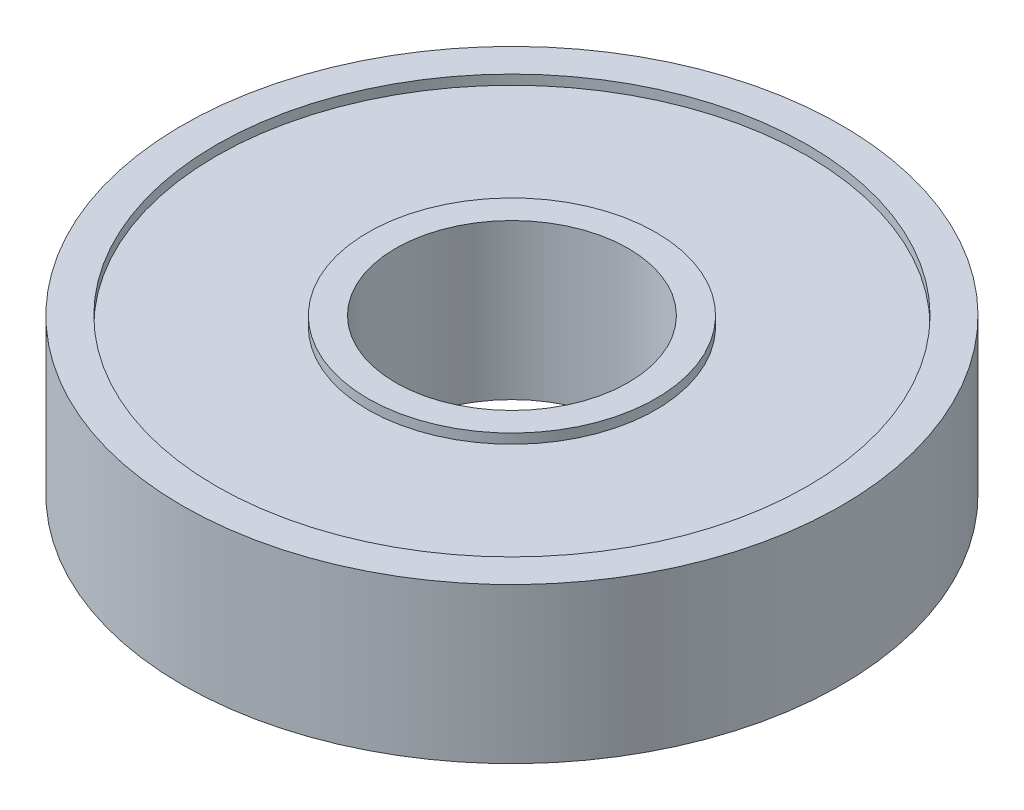
ISO-10303-21;
HEADER;
FILE_DESCRIPTION(('STEP AP214'),'2;1');
FILE_NAME('part.step','',(''),(''),'','','');
FILE_SCHEMA(('AUTOMOTIVE_DESIGN { 1 0 10303 214 1 1 1 1 }'));
ENDSEC;
DATA;
#1=APPLICATION_CONTEXT('core data for automotive mechanical design processes');
#2=APPLICATION_PROTOCOL_DEFINITION('international standard','automotive_design',2000,#1);
#3=PRODUCT_CONTEXT('',#1,'mechanical');
#4=PRODUCT('Part','Part','',(#3));
#5=PRODUCT_RELATED_PRODUCT_CATEGORY('part','',(#4));
#6=PRODUCT_DEFINITION_FORMATION('','',#4);
#7=PRODUCT_DEFINITION_CONTEXT('part definition',#1,'design');
#8=PRODUCT_DEFINITION('design','',#6,#7);
#9=PRODUCT_DEFINITION_SHAPE('','',#8);
#10=(LENGTH_UNIT() NAMED_UNIT(*) SI_UNIT(.MILLI.,.METRE.));
#11=(NAMED_UNIT(*) PLANE_ANGLE_UNIT() SI_UNIT($,.RADIAN.));
#12=(NAMED_UNIT(*) SI_UNIT($,.STERADIAN.) SOLID_ANGLE_UNIT());
#13=UNCERTAINTY_MEASURE_WITH_UNIT(LENGTH_MEASURE(1.E-05),#10,'distance_accuracy_value','');
#14=(GEOMETRIC_REPRESENTATION_CONTEXT(3) GLOBAL_UNCERTAINTY_ASSIGNED_CONTEXT((#13)) GLOBAL_UNIT_ASSIGNED_CONTEXT((#10,
#11,#12)) REPRESENTATION_CONTEXT('',''));
#15=CARTESIAN_POINT('',(0.,0.,0.));
#16=DIRECTION('',(0.,0.,1.));
#17=DIRECTION('',(1.,0.,0.));
#18=AXIS2_PLACEMENT_3D('',#15,#16,#17);
#19=CARTESIAN_POINT('',(0.,0.,0.));
#20=DIRECTION('',(0.,1.,0.));
#21=DIRECTION('',(0.,0.,1.));
#22=AXIS2_PLACEMENT_3D('',#19,#20,#21);
#23=PLANE('',#22);
#24=CARTESIAN_POINT('',(0.,0.,0.));
#25=DIRECTION('',(0.,1.,0.));
#26=DIRECTION('',(0.,0.,1.));
#27=AXIS2_PLACEMENT_3D('',#24,#25,#26);
#28=CIRCLE('',#27,6.);
#29=CARTESIAN_POINT('',(0.,0.,6.));
#30=VERTEX_POINT('',#29);
#31=EDGE_CURVE('E43',#30,#30,#28,.T.);
#32=ORIENTED_EDGE('',*,*,#31,.T.);
#33=EDGE_LOOP('',(#32));
#34=FACE_BOUND('',#33,.T.);
#35=CARTESIAN_POINT('',(0.,0.,0.));
#36=DIRECTION('',(0.,-1.,0.));
#37=DIRECTION('',(0.,0.,-1.));
#38=AXIS2_PLACEMENT_3D('',#35,#36,#37);
#39=CIRCLE('',#38,7.42735670332791);
#40=CARTESIAN_POINT('',(0.,0.,-7.42735670332791));
#41=VERTEX_POINT('',#40);
#42=EDGE_CURVE('E67',#41,#41,#39,.T.);
#43=ORIENTED_EDGE('',*,*,#42,.T.);
#44=EDGE_LOOP('',(#43));
#45=FACE_BOUND('',#44,.T.);
#46=ADVANCED_FACE('F30',(#34,#45),#23,.F.);
#47=CARTESIAN_POINT('',(0.,8.,0.));
#48=DIRECTION('',(0.,1.,0.));
#49=DIRECTION('',(0.,0.,1.));
#50=AXIS2_PLACEMENT_3D('',#47,#48,#49);
#51=PLANE('',#50);
#52=CARTESIAN_POINT('',(0.,8.,0.));
#53=DIRECTION('',(0.,1.,0.));
#54=DIRECTION('',(0.,0.,1.));
#55=AXIS2_PLACEMENT_3D('',#52,#53,#54);
#56=CIRCLE('',#55,6.);
#57=CARTESIAN_POINT('',(0.,8.,6.));
#58=VERTEX_POINT('',#57);
#59=EDGE_CURVE('E41',#58,#58,#56,.T.);
#60=ORIENTED_EDGE('',*,*,#59,.F.);
#61=EDGE_LOOP('',(#60));
#62=FACE_BOUND('',#61,.T.);
#63=CARTESIAN_POINT('',(0.,8.,0.));
#64=DIRECTION('',(0.,1.,0.));
#65=DIRECTION('',(0.,0.,1.));
#66=AXIS2_PLACEMENT_3D('',#63,#64,#65);
#67=CIRCLE('',#66,7.42735670332791);
#68=CARTESIAN_POINT('',(0.,8.,7.42735670332791));
#69=VERTEX_POINT('',#68);
#70=EDGE_CURVE('E55',#69,#69,#67,.T.);
#71=ORIENTED_EDGE('',*,*,#70,.T.);
#72=EDGE_LOOP('',(#71));
#73=FACE_BOUND('',#72,.T.);
#74=ADVANCED_FACE('F105',(#62,#73),#51,.T.);
#75=CARTESIAN_POINT('',(0.,8.,0.));
#76=DIRECTION('',(0.,1.,0.));
#77=DIRECTION('',(0.,0.,1.));
#78=AXIS2_PLACEMENT_3D('',#75,#76,#77);
#79=CIRCLE('',#78,15.251890776735);
#80=CARTESIAN_POINT('',(0.,8.,15.251890776735));
#81=VERTEX_POINT('',#80);
#82=EDGE_CURVE('E49',#81,#81,#79,.T.);
#83=ORIENTED_EDGE('',*,*,#82,.F.);
#84=EDGE_LOOP('',(#83));
#85=FACE_BOUND('',#84,.T.);
#86=CARTESIAN_POINT('',(0.,8.,0.));
#87=DIRECTION('',(0.,1.,0.));
#88=DIRECTION('',(0.,0.,1.));
#89=AXIS2_PLACEMENT_3D('',#86,#87,#88);
#90=CIRCLE('',#89,17.);
#91=CARTESIAN_POINT('',(0.,8.,17.));
#92=VERTEX_POINT('',#91);
#93=EDGE_CURVE('E10',#92,#92,#90,.T.);
#94=ORIENTED_EDGE('',*,*,#93,.T.);
#95=EDGE_LOOP('',(#94));
#96=FACE_BOUND('',#95,.T.);
#97=ADVANCED_FACE('F92',(#85,#96),#51,.T.);
#98=CARTESIAN_POINT('',(0.,0.,0.));
#99=DIRECTION('',(0.,-1.,0.));
#100=DIRECTION('',(0.,0.,-1.));
#101=AXIS2_PLACEMENT_3D('',#98,#99,#100);
#102=CIRCLE('',#101,15.251890776735);
#103=CARTESIAN_POINT('',(0.,0.,-15.251890776735));
#104=VERTEX_POINT('',#103);
#105=EDGE_CURVE('E61',#104,#104,#102,.T.);
#106=ORIENTED_EDGE('',*,*,#105,.F.);
#107=EDGE_LOOP('',(#106));
#108=FACE_BOUND('',#107,.T.);
#109=CARTESIAN_POINT('',(0.,0.,0.));
#110=DIRECTION('',(0.,1.,0.));
#111=DIRECTION('',(0.,0.,1.));
#112=AXIS2_PLACEMENT_3D('',#109,#110,#111);
#113=CIRCLE('',#112,17.);
#114=CARTESIAN_POINT('',(0.,0.,17.));
#115=VERTEX_POINT('',#114);
#116=EDGE_CURVE('E34',#115,#115,#113,.T.);
#117=ORIENTED_EDGE('',*,*,#116,.F.);
#118=EDGE_LOOP('',(#117));
#119=FACE_BOUND('',#118,.T.);
#120=ADVANCED_FACE('F89',(#108,#119),#23,.F.);
#121=CARTESIAN_POINT('',(0.,8.,0.));
#122=DIRECTION('',(0.,-1.,0.));
#123=DIRECTION('',(0.,0.,-1.));
#124=AXIS2_PLACEMENT_3D('',#121,#122,#123);
#125=CYLINDRICAL_SURFACE('',#124,17.);
#126=ORIENTED_EDGE('',*,*,#93,.F.);
#127=EDGE_LOOP('',(#126));
#128=FACE_BOUND('',#127,.T.);
#129=ORIENTED_EDGE('',*,*,#116,.T.);
#130=EDGE_LOOP('',(#129));
#131=FACE_BOUND('',#130,.T.);
#132=ADVANCED_FACE('F32',(#128,#131),#125,.T.);
#133=CARTESIAN_POINT('',(0.,8.,0.));
#134=DIRECTION('',(0.,-1.,0.));
#135=DIRECTION('',(0.,0.,-1.));
#136=AXIS2_PLACEMENT_3D('',#133,#134,#135);
#137=CYLINDRICAL_SURFACE('',#136,6.);
#138=ORIENTED_EDGE('',*,*,#59,.T.);
#139=EDGE_LOOP('',(#138));
#140=FACE_BOUND('',#139,.T.);
#141=ORIENTED_EDGE('',*,*,#31,.F.);
#142=EDGE_LOOP('',(#141));
#143=FACE_BOUND('',#142,.T.);
#144=ADVANCED_FACE('F96',(#140,#143),#137,.F.);
#145=CARTESIAN_POINT('',(0.,7.5,0.));
#146=DIRECTION('',(0.,1.,0.));
#147=DIRECTION('',(0.,0.,1.));
#148=AXIS2_PLACEMENT_3D('',#145,#146,#147);
#149=CYLINDRICAL_SURFACE('',#148,15.251890776735);
#150=CARTESIAN_POINT('',(0.,7.5,0.));
#151=DIRECTION('',(0.,1.,0.));
#152=DIRECTION('',(0.,0.,1.));
#153=AXIS2_PLACEMENT_3D('',#150,#151,#152);
#154=CIRCLE('',#153,15.251890776735);
#155=CARTESIAN_POINT('',(0.,7.5,15.251890776735));
#156=VERTEX_POINT('',#155);
#157=EDGE_CURVE('E46',#156,#156,#154,.T.);
#158=ORIENTED_EDGE('',*,*,#157,.F.);
#159=EDGE_LOOP('',(#158));
#160=FACE_BOUND('',#159,.T.);
#161=ORIENTED_EDGE('',*,*,#82,.T.);
#162=EDGE_LOOP('',(#161));
#163=FACE_BOUND('',#162,.T.);
#164=ADVANCED_FACE('F101',(#160,#163),#149,.F.);
#165=CARTESIAN_POINT('',(0.,7.5,0.));
#166=DIRECTION('',(0.,1.,0.));
#167=DIRECTION('',(0.,0.,1.));
#168=AXIS2_PLACEMENT_3D('',#165,#166,#167);
#169=PLANE('',#168);
#170=CARTESIAN_POINT('',(0.,7.5,0.));
#171=DIRECTION('',(0.,1.,0.));
#172=DIRECTION('',(0.,0.,1.));
#173=AXIS2_PLACEMENT_3D('',#170,#171,#172);
#174=CIRCLE('',#173,7.42735670332791);
#175=CARTESIAN_POINT('',(0.,7.5,7.42735670332791));
#176=VERTEX_POINT('',#175);
#177=EDGE_CURVE('E52',#176,#176,#174,.T.);
#178=ORIENTED_EDGE('',*,*,#177,.F.);
#179=EDGE_LOOP('',(#178));
#180=FACE_BOUND('',#179,.T.);
#181=ORIENTED_EDGE('',*,*,#157,.T.);
#182=EDGE_LOOP('',(#181));
#183=FACE_BOUND('',#182,.T.);
#184=ADVANCED_FACE('F118',(#180,#183),#169,.T.);
#185=CARTESIAN_POINT('',(0.,7.5,0.));
#186=DIRECTION('',(0.,1.,0.));
#187=DIRECTION('',(0.,0.,1.));
#188=AXIS2_PLACEMENT_3D('',#185,#186,#187);
#189=CYLINDRICAL_SURFACE('',#188,7.42735670332791);
#190=ORIENTED_EDGE('',*,*,#177,.T.);
#191=EDGE_LOOP('',(#190));
#192=FACE_BOUND('',#191,.T.);
#193=ORIENTED_EDGE('',*,*,#70,.F.);
#194=EDGE_LOOP('',(#193));
#195=FACE_BOUND('',#194,.T.);
#196=ADVANCED_FACE('F85',(#192,#195),#189,.T.);
#197=CARTESIAN_POINT('',(0.,0.5,0.));
#198=DIRECTION('',(0.,-1.,0.));
#199=DIRECTION('',(0.,0.,-1.));
#200=AXIS2_PLACEMENT_3D('',#197,#198,#199);
#201=CYLINDRICAL_SURFACE('',#200,15.251890776735);
#202=CARTESIAN_POINT('',(0.,0.5,0.));
#203=DIRECTION('',(0.,-1.,0.));
#204=DIRECTION('',(0.,0.,-1.));
#205=AXIS2_PLACEMENT_3D('',#202,#203,#204);
#206=CIRCLE('',#205,15.251890776735);
#207=CARTESIAN_POINT('',(0.,0.5,-15.251890776735));
#208=VERTEX_POINT('',#207);
#209=EDGE_CURVE('E58',#208,#208,#206,.T.);
#210=ORIENTED_EDGE('',*,*,#209,.F.);
#211=EDGE_LOOP('',(#210));
#212=FACE_BOUND('',#211,.T.);
#213=ORIENTED_EDGE('',*,*,#105,.T.);
#214=EDGE_LOOP('',(#213));
#215=FACE_BOUND('',#214,.T.);
#216=ADVANCED_FACE('F79',(#212,#215),#201,.F.);
#217=CARTESIAN_POINT('',(0.,0.5,0.));
#218=DIRECTION('',(0.,-1.,0.));
#219=DIRECTION('',(0.,0.,-1.));
#220=AXIS2_PLACEMENT_3D('',#217,#218,#219);
#221=PLANE('',#220);
#222=CARTESIAN_POINT('',(0.,0.5,0.));
#223=DIRECTION('',(0.,-1.,0.));
#224=DIRECTION('',(0.,0.,-1.));
#225=AXIS2_PLACEMENT_3D('',#222,#223,#224);
#226=CIRCLE('',#225,7.42735670332791);
#227=CARTESIAN_POINT('',(0.,0.5,-7.42735670332791));
#228=VERTEX_POINT('',#227);
#229=EDGE_CURVE('E64',#228,#228,#226,.T.);
#230=ORIENTED_EDGE('',*,*,#229,.F.);
#231=EDGE_LOOP('',(#230));
#232=FACE_BOUND('',#231,.T.);
#233=ORIENTED_EDGE('',*,*,#209,.T.);
#234=EDGE_LOOP('',(#233));
#235=FACE_BOUND('',#234,.T.);
#236=ADVANCED_FACE('F76',(#232,#235),#221,.T.);
#237=CARTESIAN_POINT('',(0.,0.5,0.));
#238=DIRECTION('',(0.,-1.,0.));
#239=DIRECTION('',(0.,0.,-1.));
#240=AXIS2_PLACEMENT_3D('',#237,#238,#239);
#241=CYLINDRICAL_SURFACE('',#240,7.42735670332791);
#242=ORIENTED_EDGE('',*,*,#229,.T.);
#243=EDGE_LOOP('',(#242));
#244=FACE_BOUND('',#243,.T.);
#245=ORIENTED_EDGE('',*,*,#42,.F.);
#246=EDGE_LOOP('',(#245));
#247=FACE_BOUND('',#246,.T.);
#248=ADVANCED_FACE('F73',(#244,#247),#241,.T.);
#249=CLOSED_SHELL('',(#46,#74,#97,#120,#132,#144,#164,#184,#196,#216,#236,#248));
#250=MANIFOLD_SOLID_BREP('B2',#249);
#251=ADVANCED_BREP_SHAPE_REPRESENTATION('',(#18,#250),#14);
#252=SHAPE_DEFINITION_REPRESENTATION(#9,#251);
ENDSEC;
END-ISO-10303-21;
